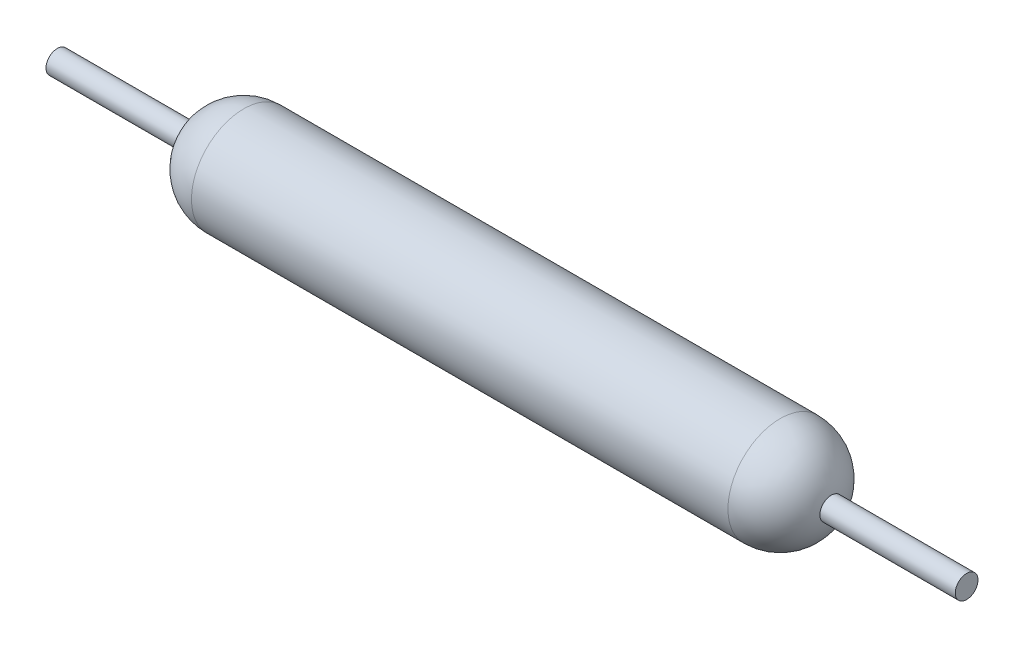
ISO-10303-21;
HEADER;
FILE_DESCRIPTION(('STEP AP214'),'2;1');
FILE_NAME('part.step','',(''),(''),'','','');
FILE_SCHEMA(('AUTOMOTIVE_DESIGN { 1 0 10303 214 1 1 1 1 }'));
ENDSEC;
DATA;
#1=APPLICATION_CONTEXT('core data for automotive mechanical design processes');
#2=APPLICATION_PROTOCOL_DEFINITION('international standard','automotive_design',2000,#1);
#3=PRODUCT_CONTEXT('',#1,'mechanical');
#4=PRODUCT('Part','Part','',(#3));
#5=PRODUCT_RELATED_PRODUCT_CATEGORY('part','',(#4));
#6=PRODUCT_DEFINITION_FORMATION('','',#4);
#7=PRODUCT_DEFINITION_CONTEXT('part definition',#1,'design');
#8=PRODUCT_DEFINITION('design','',#6,#7);
#9=PRODUCT_DEFINITION_SHAPE('','',#8);
#10=(LENGTH_UNIT() NAMED_UNIT(*) SI_UNIT(.MILLI.,.METRE.));
#11=(NAMED_UNIT(*) PLANE_ANGLE_UNIT() SI_UNIT($,.RADIAN.));
#12=(NAMED_UNIT(*) SI_UNIT($,.STERADIAN.) SOLID_ANGLE_UNIT());
#13=UNCERTAINTY_MEASURE_WITH_UNIT(LENGTH_MEASURE(1.E-05),#10,'distance_accuracy_value','');
#14=(GEOMETRIC_REPRESENTATION_CONTEXT(3) GLOBAL_UNCERTAINTY_ASSIGNED_CONTEXT((#13)) GLOBAL_UNIT_ASSIGNED_CONTEXT((#10,
#11,#12)) REPRESENTATION_CONTEXT('',''));
#15=CARTESIAN_POINT('',(0.,0.,0.));
#16=DIRECTION('',(0.,0.,1.));
#17=DIRECTION('',(1.,0.,0.));
#18=AXIS2_PLACEMENT_3D('',#15,#16,#17);
#19=CARTESIAN_POINT('',(-2.,-0.25,0.749999999999999));
#20=DIRECTION('',(0.,0.,1.));
#21=DIRECTION('',(0.,-1.,0.));
#22=AXIS2_PLACEMENT_3D('',#19,#20,#21);
#23=PLANE('',#22);
#24=DIRECTION('',(1.,0.,0.));
#25=VECTOR('',#24,1.);
#26=CARTESIAN_POINT('',(-2.,-0.35,0.75));
#27=LINE('',#26,#25);
#28=CARTESIAN_POINT('',(-2.,-0.35,0.75));
#29=VERTEX_POINT('',#28);
#30=CARTESIAN_POINT('',(6.1,-0.35,0.75));
#31=VERTEX_POINT('',#30);
#32=EDGE_CURVE('E48',#29,#31,#27,.T.);
#33=ORIENTED_EDGE('',*,*,#32,.T.);
#34=DIRECTION('',(0.,-1.,0.));
#35=VECTOR('',#34,1.);
#36=CARTESIAN_POINT('',(6.1,-0.25,0.749999999999999));
#37=LINE('',#36,#35);
#38=CARTESIAN_POINT('',(6.1,-0.25,0.749999999999999));
#39=VERTEX_POINT('',#38);
#40=EDGE_CURVE('E85',#39,#31,#37,.T.);
#41=ORIENTED_EDGE('',*,*,#40,.F.);
#42=DIRECTION('',(1.,0.,0.));
#43=VECTOR('',#42,1.);
#44=CARTESIAN_POINT('',(-2.,-0.25,0.749999999999999));
#45=LINE('',#44,#43);
#46=CARTESIAN_POINT('',(-2.,-0.25,0.749999999999999));
#47=VERTEX_POINT('',#46);
#48=EDGE_CURVE('E12',#47,#39,#45,.T.);
#49=ORIENTED_EDGE('',*,*,#48,.F.);
#50=DIRECTION('',(0.,-1.,0.));
#51=VECTOR('',#50,1.);
#52=CARTESIAN_POINT('',(-2.,-0.25,0.749999999999999));
#53=LINE('',#52,#51);
#54=EDGE_CURVE('E86',#47,#29,#53,.T.);
#55=ORIENTED_EDGE('',*,*,#54,.T.);
#56=EDGE_LOOP('',(#33,#41,#49,#55));
#57=FACE_BOUND('',#56,.T.);
#58=ADVANCED_FACE('F45',(#57),#23,.T.);
#59=CARTESIAN_POINT('',(-2.,-0.25,-0.750000000000001));
#60=DIRECTION('',(0.,1.,0.));
#61=DIRECTION('',(0.,0.,1.));
#62=AXIS2_PLACEMENT_3D('',#59,#60,#61);
#63=PLANE('',#62);
#64=ORIENTED_EDGE('',*,*,#48,.T.);
#65=DIRECTION('',(0.,0.,1.));
#66=VECTOR('',#65,1.);
#67=CARTESIAN_POINT('',(6.1,-0.25,-0.750000000000001));
#68=LINE('',#67,#66);
#69=CARTESIAN_POINT('',(6.1,-0.25,-0.750000000000001));
#70=VERTEX_POINT('',#69);
#71=EDGE_CURVE('E102',#70,#39,#68,.T.);
#72=ORIENTED_EDGE('',*,*,#71,.F.);
#73=DIRECTION('',(1.,0.,0.));
#74=VECTOR('',#73,1.);
#75=CARTESIAN_POINT('',(-2.,-0.25,-0.750000000000001));
#76=LINE('',#75,#74);
#77=CARTESIAN_POINT('',(-2.,-0.25,-0.750000000000001));
#78=VERTEX_POINT('',#77);
#79=EDGE_CURVE('E53',#78,#70,#76,.T.);
#80=ORIENTED_EDGE('',*,*,#79,.F.);
#81=DIRECTION('',(0.,0.,1.));
#82=VECTOR('',#81,1.);
#83=CARTESIAN_POINT('',(-2.,-0.25,-0.750000000000001));
#84=LINE('',#83,#82);
#85=EDGE_CURVE('E91',#78,#47,#84,.T.);
#86=ORIENTED_EDGE('',*,*,#85,.T.);
#87=EDGE_LOOP('',(#64,#72,#80,#86));
#88=FACE_BOUND('',#87,.T.);
#89=ADVANCED_FACE('F117',(#88),#63,.T.);
#90=CARTESIAN_POINT('',(-2.,-0.25,-0.750000000000001));
#91=DIRECTION('',(0.,0.,-1.));
#92=DIRECTION('',(-1.,0.,0.));
#93=AXIS2_PLACEMENT_3D('',#90,#91,#92);
#94=PLANE('',#93);
#95=ORIENTED_EDGE('',*,*,#79,.T.);
#96=DIRECTION('',(0.,1.,0.));
#97=VECTOR('',#96,1.);
#98=CARTESIAN_POINT('',(6.1,-0.25,-0.750000000000001));
#99=LINE('',#98,#97);
#100=CARTESIAN_POINT('',(6.1,-0.35,-0.750000000000001));
#101=VERTEX_POINT('',#100);
#102=EDGE_CURVE('E98',#101,#70,#99,.T.);
#103=ORIENTED_EDGE('',*,*,#102,.F.);
#104=DIRECTION('',(1.,0.,0.));
#105=VECTOR('',#104,1.);
#106=CARTESIAN_POINT('',(-2.,-0.35,-0.750000000000001));
#107=LINE('',#106,#105);
#108=CARTESIAN_POINT('',(-2.,-0.35,-0.750000000000001));
#109=VERTEX_POINT('',#108);
#110=EDGE_CURVE('E90',#109,#101,#107,.T.);
#111=ORIENTED_EDGE('',*,*,#110,.F.);
#112=DIRECTION('',(0.,1.,0.));
#113=VECTOR('',#112,1.);
#114=CARTESIAN_POINT('',(-2.,-0.25,-0.750000000000001));
#115=LINE('',#114,#113);
#116=EDGE_CURVE('E110',#109,#78,#115,.T.);
#117=ORIENTED_EDGE('',*,*,#116,.T.);
#118=EDGE_LOOP('',(#95,#103,#111,#117));
#119=FACE_BOUND('',#118,.T.);
#120=ADVANCED_FACE('F114',(#119),#94,.T.);
#121=CARTESIAN_POINT('',(-2.,-0.35,-0.750000000000001));
#122=DIRECTION('',(0.,-1.,0.));
#123=DIRECTION('',(0.,0.,-1.));
#124=AXIS2_PLACEMENT_3D('',#121,#122,#123);
#125=PLANE('',#124);
#126=ORIENTED_EDGE('',*,*,#110,.T.);
#127=DIRECTION('',(0.,0.,-1.));
#128=VECTOR('',#127,1.);
#129=CARTESIAN_POINT('',(6.1,-0.35,-0.750000000000001));
#130=LINE('',#129,#128);
#131=EDGE_CURVE('E93',#31,#101,#130,.T.);
#132=ORIENTED_EDGE('',*,*,#131,.F.);
#133=ORIENTED_EDGE('',*,*,#32,.F.);
#134=DIRECTION('',(0.,0.,-1.));
#135=VECTOR('',#134,1.);
#136=CARTESIAN_POINT('',(-2.,-0.35,-0.750000000000001));
#137=LINE('',#136,#135);
#138=EDGE_CURVE('E108',#29,#109,#137,.T.);
#139=ORIENTED_EDGE('',*,*,#138,.T.);
#140=EDGE_LOOP('',(#126,#132,#133,#139));
#141=FACE_BOUND('',#140,.T.);
#142=ADVANCED_FACE('F94',(#141),#125,.T.);
#143=CARTESIAN_POINT('',(-2.,0.,0.));
#144=DIRECTION('',(-1.,0.,0.));
#145=DIRECTION('',(0.,0.,1.));
#146=AXIS2_PLACEMENT_3D('',#143,#144,#145);
#147=PLANE('',#146);
#148=ORIENTED_EDGE('',*,*,#54,.F.);
#149=ORIENTED_EDGE('',*,*,#85,.F.);
#150=ORIENTED_EDGE('',*,*,#116,.F.);
#151=ORIENTED_EDGE('',*,*,#138,.F.);
#152=EDGE_LOOP('',(#148,#149,#150,#151));
#153=FACE_BOUND('',#152,.T.);
#154=ADVANCED_FACE('F119',(#153),#147,.T.);
#155=CARTESIAN_POINT('',(6.1,0.,0.));
#156=DIRECTION('',(-1.,0.,0.));
#157=DIRECTION('',(0.,0.,1.));
#158=AXIS2_PLACEMENT_3D('',#155,#156,#157);
#159=PLANE('',#158);
#160=ORIENTED_EDGE('',*,*,#40,.T.);
#161=ORIENTED_EDGE('',*,*,#131,.T.);
#162=ORIENTED_EDGE('',*,*,#102,.T.);
#163=ORIENTED_EDGE('',*,*,#71,.T.);
#164=EDGE_LOOP('',(#160,#161,#162,#163));
#165=FACE_BOUND('',#164,.T.);
#166=ADVANCED_FACE('F101',(#165),#159,.F.);
#167=CLOSED_SHELL('',(#58,#89,#120,#142,#154,#166));
#168=MANIFOLD_SOLID_BREP('B2',#167);
#169=CARTESIAN_POINT('',(2.,0.35,0.75));
#170=DIRECTION('',(0.,0.,-1.));
#171=DIRECTION('',(-1.,0.,0.));
#172=AXIS2_PLACEMENT_3D('',#169,#170,#171);
#173=PLANE('',#172);
#174=DIRECTION('',(-1.,0.,0.));
#175=VECTOR('',#174,1.);
#176=CARTESIAN_POINT('',(2.,0.35,0.75));
#177=LINE('',#176,#175);
#178=CARTESIAN_POINT('',(2.,0.35,0.75));
#179=VERTEX_POINT('',#178);
#180=CARTESIAN_POINT('',(-6.1,0.35,0.75));
#181=VERTEX_POINT('',#180);
#182=EDGE_CURVE('E232',#179,#181,#177,.T.);
#183=ORIENTED_EDGE('',*,*,#182,.T.);
#184=DIRECTION('',(0.,-1.,0.));
#185=VECTOR('',#184,1.);
#186=CARTESIAN_POINT('',(-6.1,0.35,0.75));
#187=LINE('',#186,#185);
#188=CARTESIAN_POINT('',(-6.1,0.25,0.75));
#189=VERTEX_POINT('',#188);
#190=EDGE_CURVE('E227',#181,#189,#187,.T.);
#191=ORIENTED_EDGE('',*,*,#190,.T.);
#192=DIRECTION('',(-1.,0.,0.));
#193=VECTOR('',#192,1.);
#194=CARTESIAN_POINT('',(2.,0.25,0.75));
#195=LINE('',#194,#193);
#196=CARTESIAN_POINT('',(2.,0.25,0.75));
#197=VERTEX_POINT('',#196);
#198=EDGE_CURVE('E43',#197,#189,#195,.T.);
#199=ORIENTED_EDGE('',*,*,#198,.F.);
#200=DIRECTION('',(0.,-1.,0.));
#201=VECTOR('',#200,1.);
#202=CARTESIAN_POINT('',(2.,0.35,0.75));
#203=LINE('',#202,#201);
#204=EDGE_CURVE('E238',#179,#197,#203,.T.);
#205=ORIENTED_EDGE('',*,*,#204,.F.);
#206=EDGE_LOOP('',(#183,#191,#199,#205));
#207=FACE_BOUND('',#206,.T.);
#208=ADVANCED_FACE('F175',(#207),#173,.F.);
#209=CARTESIAN_POINT('',(2.,0.25,-0.75));
#210=DIRECTION('',(0.,1.,0.));
#211=DIRECTION('',(0.,0.,1.));
#212=AXIS2_PLACEMENT_3D('',#209,#210,#211);
#213=PLANE('',#212);
#214=ORIENTED_EDGE('',*,*,#198,.T.);
#215=DIRECTION('',(0.,0.,-1.));
#216=VECTOR('',#215,1.);
#217=CARTESIAN_POINT('',(-6.1,0.25,-0.75));
#218=LINE('',#217,#216);
#219=CARTESIAN_POINT('',(-6.1,0.25,-0.75));
#220=VERTEX_POINT('',#219);
#221=EDGE_CURVE('E217',#189,#220,#218,.T.);
#222=ORIENTED_EDGE('',*,*,#221,.T.);
#223=DIRECTION('',(-1.,0.,0.));
#224=VECTOR('',#223,1.);
#225=CARTESIAN_POINT('',(2.,0.25,-0.75));
#226=LINE('',#225,#224);
#227=CARTESIAN_POINT('',(2.,0.25,-0.75));
#228=VERTEX_POINT('',#227);
#229=EDGE_CURVE('E182',#228,#220,#226,.T.);
#230=ORIENTED_EDGE('',*,*,#229,.F.);
#231=DIRECTION('',(0.,0.,-1.));
#232=VECTOR('',#231,1.);
#233=CARTESIAN_POINT('',(2.,0.25,-0.75));
#234=LINE('',#233,#232);
#235=EDGE_CURVE('E218',#197,#228,#234,.T.);
#236=ORIENTED_EDGE('',*,*,#235,.F.);
#237=EDGE_LOOP('',(#214,#222,#230,#236));
#238=FACE_BOUND('',#237,.T.);
#239=ADVANCED_FACE('F215',(#238),#213,.F.);
#240=CARTESIAN_POINT('',(2.,0.35,-0.75));
#241=DIRECTION('',(0.,0.,1.));
#242=DIRECTION('',(1.,0.,0.));
#243=AXIS2_PLACEMENT_3D('',#240,#241,#242);
#244=PLANE('',#243);
#245=ORIENTED_EDGE('',*,*,#229,.T.);
#246=DIRECTION('',(0.,1.,0.));
#247=VECTOR('',#246,1.);
#248=CARTESIAN_POINT('',(-6.1,0.35,-0.75));
#249=LINE('',#248,#247);
#250=CARTESIAN_POINT('',(-6.1,0.35,-0.75));
#251=VERTEX_POINT('',#250);
#252=EDGE_CURVE('E230',#220,#251,#249,.T.);
#253=ORIENTED_EDGE('',*,*,#252,.T.);
#254=DIRECTION('',(-1.,0.,0.));
#255=VECTOR('',#254,1.);
#256=CARTESIAN_POINT('',(2.,0.35,-0.75));
#257=LINE('',#256,#255);
#258=CARTESIAN_POINT('',(2.,0.35,-0.75));
#259=VERTEX_POINT('',#258);
#260=EDGE_CURVE('E244',#259,#251,#257,.T.);
#261=ORIENTED_EDGE('',*,*,#260,.F.);
#262=DIRECTION('',(0.,1.,0.));
#263=VECTOR('',#262,1.);
#264=CARTESIAN_POINT('',(2.,0.35,-0.75));
#265=LINE('',#264,#263);
#266=EDGE_CURVE('E194',#228,#259,#265,.T.);
#267=ORIENTED_EDGE('',*,*,#266,.F.);
#268=EDGE_LOOP('',(#245,#253,#261,#267));
#269=FACE_BOUND('',#268,.T.);
#270=ADVANCED_FACE('F246',(#269),#244,.F.);
#271=CARTESIAN_POINT('',(2.,0.35,-0.75));
#272=DIRECTION('',(0.,-1.,0.));
#273=DIRECTION('',(0.,0.,-1.));
#274=AXIS2_PLACEMENT_3D('',#271,#272,#273);
#275=PLANE('',#274);
#276=ORIENTED_EDGE('',*,*,#260,.T.);
#277=DIRECTION('',(0.,0.,1.));
#278=VECTOR('',#277,1.);
#279=CARTESIAN_POINT('',(-6.1,0.35,-0.75));
#280=LINE('',#279,#278);
#281=EDGE_CURVE('E236',#251,#181,#280,.T.);
#282=ORIENTED_EDGE('',*,*,#281,.T.);
#283=ORIENTED_EDGE('',*,*,#182,.F.);
#284=DIRECTION('',(0.,0.,1.));
#285=VECTOR('',#284,1.);
#286=CARTESIAN_POINT('',(2.,0.35,-0.75));
#287=LINE('',#286,#285);
#288=EDGE_CURVE('E189',#259,#179,#287,.T.);
#289=ORIENTED_EDGE('',*,*,#288,.F.);
#290=EDGE_LOOP('',(#276,#282,#283,#289));
#291=FACE_BOUND('',#290,.T.);
#292=ADVANCED_FACE('F248',(#291),#275,.F.);
#293=CARTESIAN_POINT('',(2.,0.,0.));
#294=DIRECTION('',(-1.,0.,0.));
#295=DIRECTION('',(0.,0.,1.));
#296=AXIS2_PLACEMENT_3D('',#293,#294,#295);
#297=PLANE('',#296);
#298=ORIENTED_EDGE('',*,*,#204,.T.);
#299=ORIENTED_EDGE('',*,*,#235,.T.);
#300=ORIENTED_EDGE('',*,*,#266,.T.);
#301=ORIENTED_EDGE('',*,*,#288,.T.);
#302=EDGE_LOOP('',(#298,#299,#300,#301));
#303=FACE_BOUND('',#302,.T.);
#304=ADVANCED_FACE('F249',(#303),#297,.F.);
#305=CARTESIAN_POINT('',(-6.1,0.,0.));
#306=DIRECTION('',(-1.,0.,0.));
#307=DIRECTION('',(0.,0.,1.));
#308=AXIS2_PLACEMENT_3D('',#305,#306,#307);
#309=PLANE('',#308);
#310=ORIENTED_EDGE('',*,*,#190,.F.);
#311=ORIENTED_EDGE('',*,*,#281,.F.);
#312=ORIENTED_EDGE('',*,*,#252,.F.);
#313=ORIENTED_EDGE('',*,*,#221,.F.);
#314=EDGE_LOOP('',(#310,#311,#312,#313));
#315=FACE_BOUND('',#314,.T.);
#316=ADVANCED_FACE('F225',(#315),#309,.T.);
#317=CLOSED_SHELL('',(#208,#239,#270,#292,#304,#316));
#318=MANIFOLD_SOLID_BREP('B6',#317);
#319=CARTESIAN_POINT('',(5.9,0.,0.));
#320=DIRECTION('',(1.,0.,0.));
#321=DIRECTION('',(0.,0.,-1.));
#322=AXIS2_PLACEMENT_3D('',#319,#320,#321);
#323=SPHERICAL_SURFACE('',#322,1.15);
#324=CARTESIAN_POINT('',(5.9,0.,0.));
#325=DIRECTION('',(-1.,0.,0.));
#326=DIRECTION('',(0.,0.,1.));
#327=AXIS2_PLACEMENT_3D('',#324,#325,#326);
#328=CIRCLE('',#327,1.15);
#329=CARTESIAN_POINT('',(5.9,0.,1.15));
#330=VERTEX_POINT('',#329);
#331=EDGE_CURVE('E322',#330,#330,#328,.T.);
#332=ORIENTED_EDGE('',*,*,#331,.F.);
#333=EDGE_LOOP('',(#332));
#334=FACE_BOUND('',#333,.T.);
#335=CARTESIAN_POINT('',(7.02249721603218,0.,0.));
#336=DIRECTION('',(-1.,0.,0.));
#337=DIRECTION('',(0.,0.,1.));
#338=AXIS2_PLACEMENT_3D('',#335,#336,#337);
#339=CIRCLE('',#338,0.25);
#340=CARTESIAN_POINT('',(7.02249721603218,0.,0.25));
#341=VERTEX_POINT('',#340);
#342=EDGE_CURVE('E338',#341,#341,#339,.T.);
#343=ORIENTED_EDGE('',*,*,#342,.T.);
#344=EDGE_LOOP('',(#343));
#345=FACE_BOUND('',#344,.T.);
#346=ADVANCED_FACE('F299',(#334,#345),#323,.T.);
#347=CARTESIAN_POINT('',(7.05,0.,0.));
#348=DIRECTION('',(-1.,0.,0.));
#349=DIRECTION('',(0.,0.,1.));
#350=AXIS2_PLACEMENT_3D('',#347,#348,#349);
#351=CYLINDRICAL_SURFACE('',#350,1.15);
#352=CARTESIAN_POINT('',(-5.9,0.,0.));
#353=DIRECTION('',(-1.,0.,0.));
#354=DIRECTION('',(0.,0.,1.));
#355=AXIS2_PLACEMENT_3D('',#352,#353,#354);
#356=CIRCLE('',#355,1.15);
#357=CARTESIAN_POINT('',(-5.9,0.,1.15));
#358=VERTEX_POINT('',#357);
#359=EDGE_CURVE('E325',#358,#358,#356,.F.);
#360=ORIENTED_EDGE('',*,*,#359,.T.);
#361=EDGE_LOOP('',(#360));
#362=FACE_BOUND('',#361,.T.);
#363=ORIENTED_EDGE('',*,*,#331,.T.);
#364=EDGE_LOOP('',(#363));
#365=FACE_BOUND('',#364,.T.);
#366=ADVANCED_FACE('F372',(#362,#365),#351,.T.);
#367=CARTESIAN_POINT('',(-5.9,0.,0.));
#368=DIRECTION('',(-1.,0.,0.));
#369=DIRECTION('',(0.,0.,1.));
#370=AXIS2_PLACEMENT_3D('',#367,#368,#369);
#371=SPHERICAL_SURFACE('',#370,1.15);
#372=CARTESIAN_POINT('',(-7.02249721603218,0.,0.));
#373=DIRECTION('',(1.,0.,0.));
#374=DIRECTION('',(0.,0.,-1.));
#375=AXIS2_PLACEMENT_3D('',#372,#373,#374);
#376=CIRCLE('',#375,0.25);
#377=CARTESIAN_POINT('',(-7.02249721603218,0.,-0.25));
#378=VERTEX_POINT('',#377);
#379=EDGE_CURVE('E307',#378,#378,#376,.F.);
#380=ORIENTED_EDGE('',*,*,#379,.F.);
#381=EDGE_LOOP('',(#380));
#382=FACE_BOUND('',#381,.T.);
#383=ORIENTED_EDGE('',*,*,#359,.F.);
#384=EDGE_LOOP('',(#383));
#385=FACE_BOUND('',#384,.T.);
#386=ADVANCED_FACE('F378',(#382,#385),#371,.T.);
#387=CARTESIAN_POINT('',(-10.,0.,0.));
#388=DIRECTION('',(1.,0.,0.));
#389=DIRECTION('',(0.,0.,-1.));
#390=AXIS2_PLACEMENT_3D('',#387,#388,#389);
#391=CYLINDRICAL_SURFACE('',#390,0.25);
#392=ORIENTED_EDGE('',*,*,#379,.T.);
#393=EDGE_LOOP('',(#392));
#394=FACE_BOUND('',#393,.T.);
#395=CARTESIAN_POINT('',(-10.,0.,0.));
#396=DIRECTION('',(1.,0.,0.));
#397=DIRECTION('',(0.,0.,-1.));
#398=AXIS2_PLACEMENT_3D('',#395,#396,#397);
#399=CIRCLE('',#398,0.25);
#400=CARTESIAN_POINT('',(-10.,0.,-0.25));
#401=VERTEX_POINT('',#400);
#402=EDGE_CURVE('E331',#401,#401,#399,.T.);
#403=ORIENTED_EDGE('',*,*,#402,.T.);
#404=EDGE_LOOP('',(#403));
#405=FACE_BOUND('',#404,.T.);
#406=ADVANCED_FACE('F362',(#394,#405),#391,.T.);
#407=CARTESIAN_POINT('',(-10.,0.,0.));
#408=DIRECTION('',(1.,0.,0.));
#409=DIRECTION('',(0.,0.,-1.));
#410=AXIS2_PLACEMENT_3D('',#407,#408,#409);
#411=PLANE('',#410);
#412=ORIENTED_EDGE('',*,*,#402,.F.);
#413=EDGE_LOOP('',(#412));
#414=FACE_BOUND('',#413,.T.);
#415=ADVANCED_FACE('F353',(#414),#411,.F.);
#416=CARTESIAN_POINT('',(10.,0.,0.));
#417=DIRECTION('',(-1.,0.,0.));
#418=DIRECTION('',(0.,0.,1.));
#419=AXIS2_PLACEMENT_3D('',#416,#417,#418);
#420=CYLINDRICAL_SURFACE('',#419,0.25);
#421=ORIENTED_EDGE('',*,*,#342,.F.);
#422=EDGE_LOOP('',(#421));
#423=FACE_BOUND('',#422,.T.);
#424=CARTESIAN_POINT('',(10.,0.,0.));
#425=DIRECTION('',(1.,0.,0.));
#426=DIRECTION('',(0.,0.,-1.));
#427=AXIS2_PLACEMENT_3D('',#424,#425,#426);
#428=CIRCLE('',#427,0.25);
#429=CARTESIAN_POINT('',(10.,0.,-0.25));
#430=VERTEX_POINT('',#429);
#431=EDGE_CURVE('E342',#430,#430,#428,.T.);
#432=ORIENTED_EDGE('',*,*,#431,.F.);
#433=EDGE_LOOP('',(#432));
#434=FACE_BOUND('',#433,.T.);
#435=ADVANCED_FACE('F351',(#423,#434),#420,.T.);
#436=CARTESIAN_POINT('',(10.,0.,0.));
#437=DIRECTION('',(1.,0.,0.));
#438=DIRECTION('',(0.,0.,-1.));
#439=AXIS2_PLACEMENT_3D('',#436,#437,#438);
#440=PLANE('',#439);
#441=ORIENTED_EDGE('',*,*,#431,.T.);
#442=EDGE_LOOP('',(#441));
#443=FACE_BOUND('',#442,.T.);
#444=ADVANCED_FACE('F349',(#443),#440,.T.);
#445=CLOSED_SHELL('',(#346,#366,#386,#406,#415,#435,#444));
#446=CARTESIAN_POINT('',(5.9,0.,0.));
#447=DIRECTION('',(1.,0.,0.));
#448=DIRECTION('',(0.,0.,-1.));
#449=AXIS2_PLACEMENT_3D('',#446,#447,#448);
#450=SPHERICAL_SURFACE('',#449,1.05);
#451=CARTESIAN_POINT('',(5.9,0.,0.));
#452=DIRECTION('',(-1.,0.,0.));
#453=DIRECTION('',(0.,0.,1.));
#454=AXIS2_PLACEMENT_3D('',#451,#452,#453);
#455=CIRCLE('',#454,1.05);
#456=CARTESIAN_POINT('',(5.9,0.,1.05));
#457=VERTEX_POINT('',#456);
#458=EDGE_CURVE('E311',#457,#457,#455,.T.);
#459=ORIENTED_EDGE('',*,*,#458,.T.);
#460=EDGE_LOOP('',(#459));
#461=FACE_BOUND('',#460,.T.);
#462=CARTESIAN_POINT('',(6.91980390271856,0.,0.));
#463=DIRECTION('',(-1.,0.,0.));
#464=DIRECTION('',(0.,0.,1.));
#465=AXIS2_PLACEMENT_3D('',#462,#463,#464);
#466=CIRCLE('',#465,0.25);
#467=CARTESIAN_POINT('',(6.91980390271856,0.,0.25));
#468=VERTEX_POINT('',#467);
#469=EDGE_CURVE('E174',#468,#468,#466,.T.);
#470=ORIENTED_EDGE('',*,*,#469,.F.);
#471=EDGE_LOOP('',(#470));
#472=FACE_BOUND('',#471,.T.);
#473=ADVANCED_FACE('F390',(#461,#472),#450,.F.);
#474=CARTESIAN_POINT('',(7.05,0.,0.));
#475=DIRECTION('',(-1.,0.,0.));
#476=DIRECTION('',(0.,0.,1.));
#477=AXIS2_PLACEMENT_3D('',#474,#475,#476);
#478=CYLINDRICAL_SURFACE('',#477,1.05);
#479=CARTESIAN_POINT('',(-5.9,0.,0.));
#480=DIRECTION('',(-1.,0.,0.));
#481=DIRECTION('',(0.,0.,1.));
#482=AXIS2_PLACEMENT_3D('',#479,#480,#481);
#483=CIRCLE('',#482,1.05);
#484=CARTESIAN_POINT('',(-5.9,0.,1.05));
#485=VERTEX_POINT('',#484);
#486=EDGE_CURVE('E316',#485,#485,#483,.F.);
#487=ORIENTED_EDGE('',*,*,#486,.F.);
#488=EDGE_LOOP('',(#487));
#489=FACE_BOUND('',#488,.T.);
#490=ORIENTED_EDGE('',*,*,#458,.F.);
#491=EDGE_LOOP('',(#490));
#492=FACE_BOUND('',#491,.T.);
#493=ADVANCED_FACE('F388',(#489,#492),#478,.F.);
#494=CARTESIAN_POINT('',(-5.9,0.,0.));
#495=DIRECTION('',(-1.,0.,0.));
#496=DIRECTION('',(0.,0.,1.));
#497=AXIS2_PLACEMENT_3D('',#494,#495,#496);
#498=SPHERICAL_SURFACE('',#497,1.05);
#499=CARTESIAN_POINT('',(-6.91980390271856,0.,0.));
#500=DIRECTION('',(1.,0.,0.));
#501=DIRECTION('',(0.,0.,-1.));
#502=AXIS2_PLACEMENT_3D('',#499,#500,#501);
#503=CIRCLE('',#502,0.25);
#504=CARTESIAN_POINT('',(-6.91980390271856,0.,-0.25));
#505=VERTEX_POINT('',#504);
#506=EDGE_CURVE('E326',#505,#505,#503,.F.);
#507=ORIENTED_EDGE('',*,*,#506,.T.);
#508=EDGE_LOOP('',(#507));
#509=FACE_BOUND('',#508,.T.);
#510=ORIENTED_EDGE('',*,*,#486,.T.);
#511=EDGE_LOOP('',(#510));
#512=FACE_BOUND('',#511,.T.);
#513=ADVANCED_FACE('F301',(#509,#512),#498,.F.);
#514=CARTESIAN_POINT('',(-5.,0.,0.));
#515=DIRECTION('',(1.,0.,0.));
#516=DIRECTION('',(0.,0.,-1.));
#517=AXIS2_PLACEMENT_3D('',#514,#515,#516);
#518=PLANE('',#517);
#519=CARTESIAN_POINT('',(-5.,0.,0.));
#520=DIRECTION('',(1.,0.,0.));
#521=DIRECTION('',(0.,0.,-1.));
#522=AXIS2_PLACEMENT_3D('',#519,#520,#521);
#523=CIRCLE('',#522,0.25);
#524=CARTESIAN_POINT('',(-5.,0.,-0.25));
#525=VERTEX_POINT('',#524);
#526=EDGE_CURVE('E320',#525,#525,#523,.T.);
#527=ORIENTED_EDGE('',*,*,#526,.T.);
#528=EDGE_LOOP('',(#527));
#529=FACE_BOUND('',#528,.T.);
#530=ADVANCED_FACE('F414',(#529),#518,.T.);
#531=ORIENTED_EDGE('',*,*,#526,.F.);
#532=EDGE_LOOP('',(#531));
#533=FACE_BOUND('',#532,.T.);
#534=ORIENTED_EDGE('',*,*,#506,.F.);
#535=EDGE_LOOP('',(#534));
#536=FACE_BOUND('',#535,.T.);
#537=ADVANCED_FACE('F421',(#533,#536),#391,.T.);
#538=CARTESIAN_POINT('',(5.,0.,0.));
#539=DIRECTION('',(1.,0.,0.));
#540=DIRECTION('',(0.,0.,-1.));
#541=AXIS2_PLACEMENT_3D('',#538,#539,#540);
#542=PLANE('',#541);
#543=CARTESIAN_POINT('',(5.,0.,0.));
#544=DIRECTION('',(1.,0.,0.));
#545=DIRECTION('',(0.,0.,-1.));
#546=AXIS2_PLACEMENT_3D('',#543,#544,#545);
#547=CIRCLE('',#546,0.25);
#548=CARTESIAN_POINT('',(5.,0.,-0.25));
#549=VERTEX_POINT('',#548);
#550=EDGE_CURVE('E343',#549,#549,#547,.T.);
#551=ORIENTED_EDGE('',*,*,#550,.F.);
#552=EDGE_LOOP('',(#551));
#553=FACE_BOUND('',#552,.T.);
#554=ADVANCED_FACE('F368',(#553),#542,.F.);
#555=ORIENTED_EDGE('',*,*,#550,.T.);
#556=EDGE_LOOP('',(#555));
#557=FACE_BOUND('',#556,.T.);
#558=ORIENTED_EDGE('',*,*,#469,.T.);
#559=EDGE_LOOP('',(#558));
#560=FACE_BOUND('',#559,.T.);
#561=ADVANCED_FACE('F356',(#557,#560),#420,.T.);
#562=CLOSED_SHELL('',(#473,#493,#513,#530,#537,#554,#561));
#563=ORIENTED_CLOSED_SHELL('',*,#562,.T.);
#564=BREP_WITH_VOIDS('B37',#445,(#563));
#565=ADVANCED_BREP_SHAPE_REPRESENTATION('',(#18,#168,#318,#564),#14);
#566=SHAPE_DEFINITION_REPRESENTATION(#9,#565);
ENDSEC;
END-ISO-10303-21;
